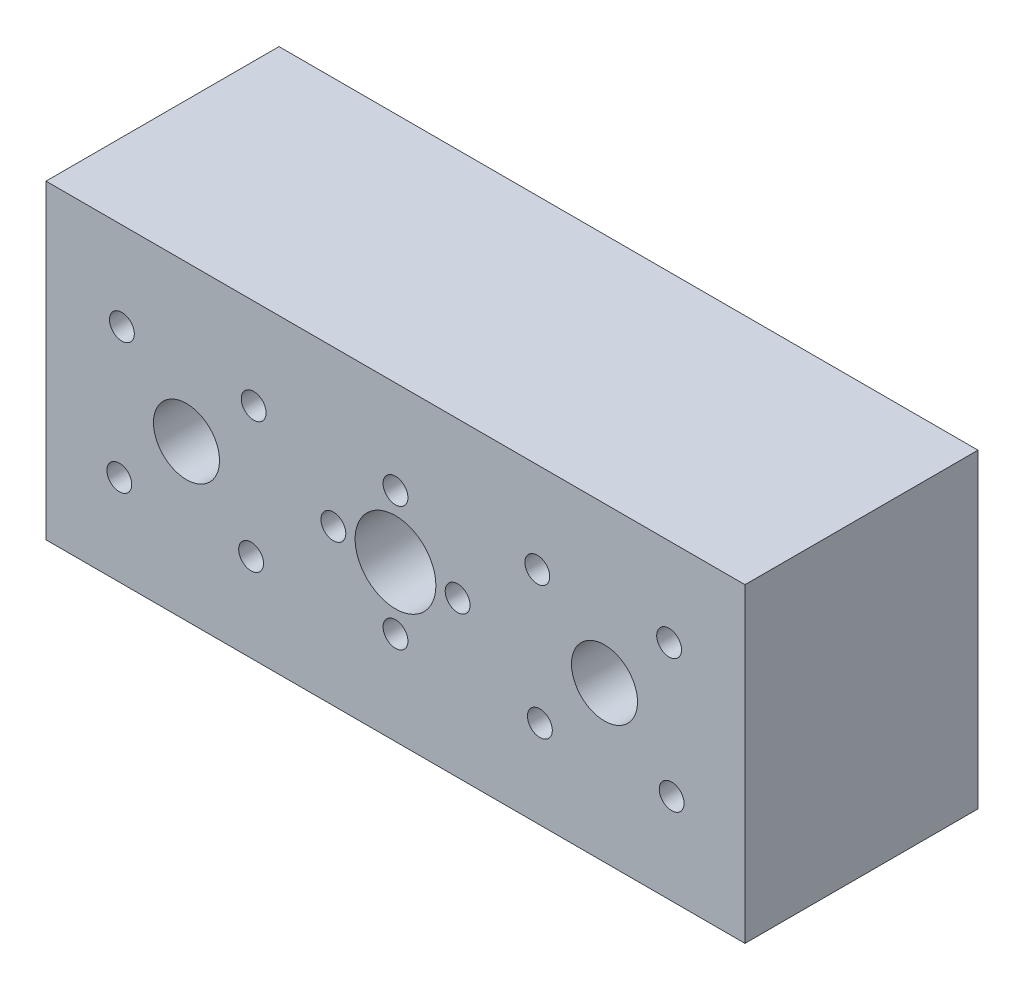
ISO-10303-21;
HEADER;
FILE_DESCRIPTION(('STEP AP214'),'2;1');
FILE_NAME('part.step','',(''),(''),'','','');
FILE_SCHEMA(('AUTOMOTIVE_DESIGN { 1 0 10303 214 1 1 1 1 }'));
ENDSEC;
DATA;
#1=APPLICATION_CONTEXT('core data for automotive mechanical design processes');
#2=APPLICATION_PROTOCOL_DEFINITION('international standard','automotive_design',2000,#1);
#3=PRODUCT_CONTEXT('',#1,'mechanical');
#4=PRODUCT('Part','Part','',(#3));
#5=PRODUCT_RELATED_PRODUCT_CATEGORY('part','',(#4));
#6=PRODUCT_DEFINITION_FORMATION('','',#4);
#7=PRODUCT_DEFINITION_CONTEXT('part definition',#1,'design');
#8=PRODUCT_DEFINITION('design','',#6,#7);
#9=PRODUCT_DEFINITION_SHAPE('','',#8);
#10=(LENGTH_UNIT() NAMED_UNIT(*) SI_UNIT(.MILLI.,.METRE.));
#11=(NAMED_UNIT(*) PLANE_ANGLE_UNIT() SI_UNIT($,.RADIAN.));
#12=(NAMED_UNIT(*) SI_UNIT($,.STERADIAN.) SOLID_ANGLE_UNIT());
#13=UNCERTAINTY_MEASURE_WITH_UNIT(LENGTH_MEASURE(1.E-05),#10,'distance_accuracy_value','');
#14=(GEOMETRIC_REPRESENTATION_CONTEXT(3) GLOBAL_UNCERTAINTY_ASSIGNED_CONTEXT((#13)) GLOBAL_UNIT_ASSIGNED_CONTEXT((#10,
#11,#12)) REPRESENTATION_CONTEXT('',''));
#15=CARTESIAN_POINT('',(0.,0.,0.));
#16=DIRECTION('',(0.,0.,1.));
#17=DIRECTION('',(1.,0.,0.));
#18=AXIS2_PLACEMENT_3D('',#15,#16,#17);
#19=CARTESIAN_POINT('',(45.,-20.,30.));
#20=DIRECTION('',(-1.,0.,0.));
#21=DIRECTION('',(0.,0.,1.));
#22=AXIS2_PLACEMENT_3D('',#19,#20,#21);
#23=PLANE('',#22);
#24=DIRECTION('',(0.,1.,0.));
#25=VECTOR('',#24,1.);
#26=CARTESIAN_POINT('',(45.,-20.,0.));
#27=LINE('',#26,#25);
#28=CARTESIAN_POINT('',(45.,-20.,0.));
#29=VERTEX_POINT('',#28);
#30=CARTESIAN_POINT('',(45.,20.,0.));
#31=VERTEX_POINT('',#30);
#32=EDGE_CURVE('E101',#29,#31,#27,.T.);
#33=ORIENTED_EDGE('',*,*,#32,.T.);
#34=DIRECTION('',(0.,0.,-1.));
#35=VECTOR('',#34,1.);
#36=CARTESIAN_POINT('',(45.,20.,30.));
#37=LINE('',#36,#35);
#38=CARTESIAN_POINT('',(45.,20.,30.));
#39=VERTEX_POINT('',#38);
#40=EDGE_CURVE('E11',#39,#31,#37,.T.);
#41=ORIENTED_EDGE('',*,*,#40,.F.);
#42=DIRECTION('',(0.,1.,0.));
#43=VECTOR('',#42,1.);
#44=CARTESIAN_POINT('',(45.,-20.,30.));
#45=LINE('',#44,#43);
#46=CARTESIAN_POINT('',(45.,-20.,30.));
#47=VERTEX_POINT('',#46);
#48=EDGE_CURVE('E88',#47,#39,#45,.T.);
#49=ORIENTED_EDGE('',*,*,#48,.F.);
#50=DIRECTION('',(0.,0.,-1.));
#51=VECTOR('',#50,1.);
#52=CARTESIAN_POINT('',(45.,-20.,30.));
#53=LINE('',#52,#51);
#54=EDGE_CURVE('E97',#47,#29,#53,.T.);
#55=ORIENTED_EDGE('',*,*,#54,.T.);
#56=EDGE_LOOP('',(#33,#41,#49,#55));
#57=FACE_BOUND('',#56,.T.);
#58=ADVANCED_FACE('F35',(#57),#23,.F.);
#59=CARTESIAN_POINT('',(-45.,20.,30.));
#60=DIRECTION('',(0.,-1.,0.));
#61=DIRECTION('',(0.,0.,-1.));
#62=AXIS2_PLACEMENT_3D('',#59,#60,#61);
#63=PLANE('',#62);
#64=DIRECTION('',(-1.,0.,0.));
#65=VECTOR('',#64,1.);
#66=CARTESIAN_POINT('',(-45.,20.,0.));
#67=LINE('',#66,#65);
#68=CARTESIAN_POINT('',(-45.,20.,0.));
#69=VERTEX_POINT('',#68);
#70=EDGE_CURVE('E92',#31,#69,#67,.T.);
#71=ORIENTED_EDGE('',*,*,#70,.T.);
#72=DIRECTION('',(0.,0.,-1.));
#73=VECTOR('',#72,1.);
#74=CARTESIAN_POINT('',(-45.,20.,30.));
#75=LINE('',#74,#73);
#76=CARTESIAN_POINT('',(-45.,20.,30.));
#77=VERTEX_POINT('',#76);
#78=EDGE_CURVE('E44',#77,#69,#75,.T.);
#79=ORIENTED_EDGE('',*,*,#78,.F.);
#80=DIRECTION('',(-1.,0.,0.));
#81=VECTOR('',#80,1.);
#82=CARTESIAN_POINT('',(-45.,20.,30.));
#83=LINE('',#82,#81);
#84=EDGE_CURVE('E83',#39,#77,#83,.T.);
#85=ORIENTED_EDGE('',*,*,#84,.F.);
#86=ORIENTED_EDGE('',*,*,#40,.T.);
#87=EDGE_LOOP('',(#71,#79,#85,#86));
#88=FACE_BOUND('',#87,.T.);
#89=ADVANCED_FACE('F91',(#88),#63,.F.);
#90=CARTESIAN_POINT('',(-45.,-20.,30.));
#91=DIRECTION('',(1.,0.,0.));
#92=DIRECTION('',(0.,0.,-1.));
#93=AXIS2_PLACEMENT_3D('',#90,#91,#92);
#94=PLANE('',#93);
#95=DIRECTION('',(0.,-1.,0.));
#96=VECTOR('',#95,1.);
#97=CARTESIAN_POINT('',(-45.,-20.,0.));
#98=LINE('',#97,#96);
#99=CARTESIAN_POINT('',(-45.,-20.,0.));
#100=VERTEX_POINT('',#99);
#101=EDGE_CURVE('E70',#69,#100,#98,.T.);
#102=ORIENTED_EDGE('',*,*,#101,.T.);
#103=DIRECTION('',(0.,0.,-1.));
#104=VECTOR('',#103,1.);
#105=CARTESIAN_POINT('',(-45.,-20.,30.));
#106=LINE('',#105,#104);
#107=CARTESIAN_POINT('',(-45.,-20.,30.));
#108=VERTEX_POINT('',#107);
#109=EDGE_CURVE('E93',#108,#100,#106,.T.);
#110=ORIENTED_EDGE('',*,*,#109,.F.);
#111=DIRECTION('',(0.,-1.,0.));
#112=VECTOR('',#111,1.);
#113=CARTESIAN_POINT('',(-45.,-20.,30.));
#114=LINE('',#113,#112);
#115=EDGE_CURVE('E86',#77,#108,#114,.T.);
#116=ORIENTED_EDGE('',*,*,#115,.F.);
#117=ORIENTED_EDGE('',*,*,#78,.T.);
#118=EDGE_LOOP('',(#102,#110,#116,#117));
#119=FACE_BOUND('',#118,.T.);
#120=ADVANCED_FACE('F95',(#119),#94,.F.);
#121=CARTESIAN_POINT('',(-45.,-20.,30.));
#122=DIRECTION('',(0.,1.,0.));
#123=DIRECTION('',(0.,0.,1.));
#124=AXIS2_PLACEMENT_3D('',#121,#122,#123);
#125=PLANE('',#124);
#126=DIRECTION('',(1.,0.,0.));
#127=VECTOR('',#126,1.);
#128=CARTESIAN_POINT('',(-45.,-20.,0.));
#129=LINE('',#128,#127);
#130=EDGE_CURVE('E76',#100,#29,#129,.T.);
#131=ORIENTED_EDGE('',*,*,#130,.T.);
#132=ORIENTED_EDGE('',*,*,#54,.F.);
#133=DIRECTION('',(1.,0.,0.));
#134=VECTOR('',#133,1.);
#135=CARTESIAN_POINT('',(-45.,-20.,30.));
#136=LINE('',#135,#134);
#137=EDGE_CURVE('E53',#108,#47,#136,.T.);
#138=ORIENTED_EDGE('',*,*,#137,.F.);
#139=ORIENTED_EDGE('',*,*,#109,.T.);
#140=EDGE_LOOP('',(#131,#132,#138,#139));
#141=FACE_BOUND('',#140,.T.);
#142=ADVANCED_FACE('F212',(#141),#125,.F.);
#143=CARTESIAN_POINT('',(0.,0.,30.));
#144=DIRECTION('',(0.,0.,-1.));
#145=DIRECTION('',(-1.,0.,0.));
#146=AXIS2_PLACEMENT_3D('',#143,#144,#145);
#147=PLANE('',#146);
#148=CARTESIAN_POINT('',(-18.2611815212582,8.31934769647122,30.));
#149=DIRECTION('',(0.,0.,-1.));
#150=DIRECTION('',(-1.,0.,0.));
#151=AXIS2_PLACEMENT_3D('',#148,#149,#150);
#152=CIRCLE('',#151,1.60000000000001);
#153=CARTESIAN_POINT('',(-19.8611815212582,8.31934769647122,30.));
#154=VERTEX_POINT('',#153);
#155=EDGE_CURVE('E460',#154,#154,#152,.T.);
#156=ORIENTED_EDGE('',*,*,#155,.T.);
#157=EDGE_LOOP('',(#156));
#158=FACE_BOUND('',#157,.T.);
#159=CARTESIAN_POINT('',(-35.228561011451,8.64803179372157,30.));
#160=DIRECTION('',(0.,0.,-1.));
#161=DIRECTION('',(-1.,0.,0.));
#162=AXIS2_PLACEMENT_3D('',#159,#160,#161);
#163=CIRCLE('',#162,1.60000000000001);
#164=CARTESIAN_POINT('',(-36.828561011451,8.64803179372157,30.));
#165=VERTEX_POINT('',#164);
#166=EDGE_CURVE('E466',#165,#165,#163,.T.);
#167=ORIENTED_EDGE('',*,*,#166,.T.);
#168=EDGE_LOOP('',(#167));
#169=FACE_BOUND('',#168,.T.);
#170=CARTESIAN_POINT('',(-35.5572451087013,-8.31934769647122,30.));
#171=DIRECTION('',(0.,0.,-1.));
#172=DIRECTION('',(-1.,0.,0.));
#173=AXIS2_PLACEMENT_3D('',#170,#171,#172);
#174=CIRCLE('',#173,1.60000000000001);
#175=CARTESIAN_POINT('',(-37.1572451087013,-8.31934769647122,30.));
#176=VERTEX_POINT('',#175);
#177=EDGE_CURVE('E472',#176,#176,#174,.T.);
#178=ORIENTED_EDGE('',*,*,#177,.T.);
#179=EDGE_LOOP('',(#178));
#180=FACE_BOUND('',#179,.T.);
#181=CARTESIAN_POINT('',(-18.5898656185085,-8.64803179372157,30.));
#182=DIRECTION('',(0.,0.,-1.));
#183=DIRECTION('',(-1.,0.,0.));
#184=AXIS2_PLACEMENT_3D('',#181,#182,#183);
#185=CIRCLE('',#184,1.60000000000001);
#186=CARTESIAN_POINT('',(-20.1898656185086,-8.64803179372157,30.));
#187=VERTEX_POINT('',#186);
#188=EDGE_CURVE('E478',#187,#187,#185,.T.);
#189=ORIENTED_EDGE('',*,*,#188,.T.);
#190=EDGE_LOOP('',(#189));
#191=FACE_BOUND('',#190,.T.);
#192=CARTESIAN_POINT('',(-26.9092133149798,0.,30.));
#193=DIRECTION('',(0.,0.,-1.));
#194=DIRECTION('',(-1.,0.,0.));
#195=AXIS2_PLACEMENT_3D('',#192,#193,#194);
#196=CIRCLE('',#195,4.25000000000001);
#197=CARTESIAN_POINT('',(-31.1592133149798,0.,30.));
#198=VERTEX_POINT('',#197);
#199=EDGE_CURVE('E128',#198,#198,#196,.T.);
#200=ORIENTED_EDGE('',*,*,#199,.T.);
#201=EDGE_LOOP('',(#200));
#202=FACE_BOUND('',#201,.T.);
#203=CARTESIAN_POINT('',(18.2611815212582,8.31934769647122,30.));
#204=DIRECTION('',(0.,0.,-1.));
#205=DIRECTION('',(-1.,0.,0.));
#206=AXIS2_PLACEMENT_3D('',#203,#204,#205);
#207=CIRCLE('',#206,1.60000000000001);
#208=CARTESIAN_POINT('',(16.6611815212582,8.31934769647122,30.));
#209=VERTEX_POINT('',#208);
#210=EDGE_CURVE('E120',#209,#209,#207,.T.);
#211=ORIENTED_EDGE('',*,*,#210,.T.);
#212=EDGE_LOOP('',(#211));
#213=FACE_BOUND('',#212,.T.);
#214=CARTESIAN_POINT('',(35.228561011451,8.64803179372157,30.));
#215=DIRECTION('',(0.,0.,-1.));
#216=DIRECTION('',(-1.,0.,0.));
#217=AXIS2_PLACEMENT_3D('',#214,#215,#216);
#218=CIRCLE('',#217,1.60000000000001);
#219=CARTESIAN_POINT('',(33.628561011451,8.64803179372157,30.));
#220=VERTEX_POINT('',#219);
#221=EDGE_CURVE('E137',#220,#220,#218,.T.);
#222=ORIENTED_EDGE('',*,*,#221,.T.);
#223=EDGE_LOOP('',(#222));
#224=FACE_BOUND('',#223,.T.);
#225=CARTESIAN_POINT('',(35.5572451087013,-8.31934769647122,30.));
#226=DIRECTION('',(0.,0.,-1.));
#227=DIRECTION('',(-1.,0.,0.));
#228=AXIS2_PLACEMENT_3D('',#225,#226,#227);
#229=CIRCLE('',#228,1.60000000000001);
#230=CARTESIAN_POINT('',(33.9572451087013,-8.31934769647122,30.));
#231=VERTEX_POINT('',#230);
#232=EDGE_CURVE('E143',#231,#231,#229,.T.);
#233=ORIENTED_EDGE('',*,*,#232,.T.);
#234=EDGE_LOOP('',(#233));
#235=FACE_BOUND('',#234,.T.);
#236=CARTESIAN_POINT('',(18.5898656185085,-8.64803179372157,30.));
#237=DIRECTION('',(0.,0.,-1.));
#238=DIRECTION('',(-1.,0.,0.));
#239=AXIS2_PLACEMENT_3D('',#236,#237,#238);
#240=CIRCLE('',#239,1.60000000000001);
#241=CARTESIAN_POINT('',(16.9898656185085,-8.64803179372157,30.));
#242=VERTEX_POINT('',#241);
#243=EDGE_CURVE('E149',#242,#242,#240,.T.);
#244=ORIENTED_EDGE('',*,*,#243,.T.);
#245=EDGE_LOOP('',(#244));
#246=FACE_BOUND('',#245,.T.);
#247=CARTESIAN_POINT('',(26.9092133149798,0.,30.));
#248=DIRECTION('',(0.,0.,-1.));
#249=DIRECTION('',(-1.,0.,0.));
#250=AXIS2_PLACEMENT_3D('',#247,#248,#249);
#251=CIRCLE('',#250,4.25000000000001);
#252=CARTESIAN_POINT('',(22.6592133149797,0.,30.));
#253=VERTEX_POINT('',#252);
#254=EDGE_CURVE('E152',#253,#253,#251,.T.);
#255=ORIENTED_EDGE('',*,*,#254,.T.);
#256=EDGE_LOOP('',(#255));
#257=FACE_BOUND('',#256,.T.);
#258=CARTESIAN_POINT('',(8.,0.,30.));
#259=DIRECTION('',(0.,0.,1.));
#260=DIRECTION('',(1.,0.,0.));
#261=AXIS2_PLACEMENT_3D('',#258,#259,#260);
#262=CIRCLE('',#261,1.60000000000001);
#263=CARTESIAN_POINT('',(9.60000000000001,0.,30.));
#264=VERTEX_POINT('',#263);
#265=EDGE_CURVE('E155',#264,#264,#262,.T.);
#266=ORIENTED_EDGE('',*,*,#265,.F.);
#267=EDGE_LOOP('',(#266));
#268=FACE_BOUND('',#267,.T.);
#269=CARTESIAN_POINT('',(0.,8.,30.));
#270=DIRECTION('',(0.,0.,1.));
#271=DIRECTION('',(1.,0.,0.));
#272=AXIS2_PLACEMENT_3D('',#269,#270,#271);
#273=CIRCLE('',#272,1.60000000000001);
#274=CARTESIAN_POINT('',(1.6000000000001,8.,30.));
#275=VERTEX_POINT('',#274);
#276=EDGE_CURVE('E161',#275,#275,#273,.T.);
#277=ORIENTED_EDGE('',*,*,#276,.F.);
#278=EDGE_LOOP('',(#277));
#279=FACE_BOUND('',#278,.T.);
#280=CARTESIAN_POINT('',(-8.,0.,30.));
#281=DIRECTION('',(0.,0.,1.));
#282=DIRECTION('',(1.,0.,0.));
#283=AXIS2_PLACEMENT_3D('',#280,#281,#282);
#284=CIRCLE('',#283,1.60000000000001);
#285=CARTESIAN_POINT('',(-6.39999999999999,0.,30.));
#286=VERTEX_POINT('',#285);
#287=EDGE_CURVE('E167',#286,#286,#284,.T.);
#288=ORIENTED_EDGE('',*,*,#287,.F.);
#289=EDGE_LOOP('',(#288));
#290=FACE_BOUND('',#289,.T.);
#291=CARTESIAN_POINT('',(0.,-8.,30.));
#292=DIRECTION('',(0.,0.,1.));
#293=DIRECTION('',(1.,0.,0.));
#294=AXIS2_PLACEMENT_3D('',#291,#292,#293);
#295=CIRCLE('',#294,1.60000000000001);
#296=CARTESIAN_POINT('',(1.59999999999998,-8.,30.));
#297=VERTEX_POINT('',#296);
#298=EDGE_CURVE('E173',#297,#297,#295,.T.);
#299=ORIENTED_EDGE('',*,*,#298,.F.);
#300=EDGE_LOOP('',(#299));
#301=FACE_BOUND('',#300,.T.);
#302=CARTESIAN_POINT('',(0.,0.,30.));
#303=DIRECTION('',(0.,0.,1.));
#304=DIRECTION('',(1.,0.,0.));
#305=AXIS2_PLACEMENT_3D('',#302,#303,#304);
#306=CIRCLE('',#305,5.20000000000001);
#307=CARTESIAN_POINT('',(5.20000000000001,0.,30.));
#308=VERTEX_POINT('',#307);
#309=EDGE_CURVE('E179',#308,#308,#306,.T.);
#310=ORIENTED_EDGE('',*,*,#309,.F.);
#311=EDGE_LOOP('',(#310));
#312=FACE_BOUND('',#311,.T.);
#313=ORIENTED_EDGE('',*,*,#48,.T.);
#314=ORIENTED_EDGE('',*,*,#84,.T.);
#315=ORIENTED_EDGE('',*,*,#115,.T.);
#316=ORIENTED_EDGE('',*,*,#137,.T.);
#317=EDGE_LOOP('',(#313,#314,#315,#316));
#318=FACE_BOUND('',#317,.T.);
#319=ADVANCED_FACE('F84',(#158,#169,#180,#191,#202,#213,#224,#235,#246,#257,#268,#279,#290,#301,
#312,#318),#147,.F.);
#320=CARTESIAN_POINT('',(0.,0.,0.));
#321=DIRECTION('',(0.,0.,-1.));
#322=DIRECTION('',(-1.,0.,0.));
#323=AXIS2_PLACEMENT_3D('',#320,#321,#322);
#324=PLANE('',#323);
#325=CARTESIAN_POINT('',(-26.9092133149798,0.,0.));
#326=DIRECTION('',(0.,0.,-1.));
#327=DIRECTION('',(-1.,0.,0.));
#328=AXIS2_PLACEMENT_3D('',#325,#326,#327);
#329=CIRCLE('',#328,8.50000000000001);
#330=CARTESIAN_POINT('',(-35.4092133149798,0.,0.));
#331=VERTEX_POINT('',#330);
#332=EDGE_CURVE('E453',#331,#331,#329,.T.);
#333=ORIENTED_EDGE('',*,*,#332,.F.);
#334=EDGE_LOOP('',(#333));
#335=FACE_BOUND('',#334,.T.);
#336=CARTESIAN_POINT('',(-18.2611815212582,8.31934769647122,0.));
#337=DIRECTION('',(0.,0.,-1.));
#338=DIRECTION('',(-1.,0.,0.));
#339=AXIS2_PLACEMENT_3D('',#336,#337,#338);
#340=CIRCLE('',#339,1.60000000000001);
#341=CARTESIAN_POINT('',(-19.8611815212582,8.31934769647122,0.));
#342=VERTEX_POINT('',#341);
#343=EDGE_CURVE('E457',#342,#342,#340,.T.);
#344=ORIENTED_EDGE('',*,*,#343,.F.);
#345=EDGE_LOOP('',(#344));
#346=FACE_BOUND('',#345,.T.);
#347=CARTESIAN_POINT('',(-35.228561011451,8.64803179372157,0.));
#348=DIRECTION('',(0.,0.,-1.));
#349=DIRECTION('',(-1.,0.,0.));
#350=AXIS2_PLACEMENT_3D('',#347,#348,#349);
#351=CIRCLE('',#350,1.60000000000002);
#352=CARTESIAN_POINT('',(-36.828561011451,8.64803179372157,0.));
#353=VERTEX_POINT('',#352);
#354=EDGE_CURVE('E463',#353,#353,#351,.T.);
#355=ORIENTED_EDGE('',*,*,#354,.F.);
#356=EDGE_LOOP('',(#355));
#357=FACE_BOUND('',#356,.T.);
#358=CARTESIAN_POINT('',(-35.5572451087013,-8.31934769647122,0.));
#359=DIRECTION('',(0.,0.,-1.));
#360=DIRECTION('',(-1.,0.,0.));
#361=AXIS2_PLACEMENT_3D('',#358,#359,#360);
#362=CIRCLE('',#361,1.60000000000002);
#363=CARTESIAN_POINT('',(-37.1572451087013,-8.31934769647122,0.));
#364=VERTEX_POINT('',#363);
#365=EDGE_CURVE('E469',#364,#364,#362,.T.);
#366=ORIENTED_EDGE('',*,*,#365,.F.);
#367=EDGE_LOOP('',(#366));
#368=FACE_BOUND('',#367,.T.);
#369=CARTESIAN_POINT('',(-18.5898656185085,-8.64803179372157,0.));
#370=DIRECTION('',(0.,0.,-1.));
#371=DIRECTION('',(-1.,0.,0.));
#372=AXIS2_PLACEMENT_3D('',#369,#370,#371);
#373=CIRCLE('',#372,1.60000000000001);
#374=CARTESIAN_POINT('',(-20.1898656185086,-8.64803179372157,0.));
#375=VERTEX_POINT('',#374);
#376=EDGE_CURVE('E475',#375,#375,#373,.T.);
#377=ORIENTED_EDGE('',*,*,#376,.F.);
#378=EDGE_LOOP('',(#377));
#379=FACE_BOUND('',#378,.T.);
#380=CARTESIAN_POINT('',(26.9092133149798,0.,0.));
#381=DIRECTION('',(0.,0.,-1.));
#382=DIRECTION('',(-1.,0.,0.));
#383=AXIS2_PLACEMENT_3D('',#380,#381,#382);
#384=CIRCLE('',#383,8.50000000000001);
#385=CARTESIAN_POINT('',(18.4092133149797,0.,0.));
#386=VERTEX_POINT('',#385);
#387=EDGE_CURVE('E123',#386,#386,#384,.T.);
#388=ORIENTED_EDGE('',*,*,#387,.F.);
#389=EDGE_LOOP('',(#388));
#390=FACE_BOUND('',#389,.T.);
#391=CARTESIAN_POINT('',(18.2611815212582,8.31934769647122,0.));
#392=DIRECTION('',(0.,0.,-1.));
#393=DIRECTION('',(-1.,0.,0.));
#394=AXIS2_PLACEMENT_3D('',#391,#392,#393);
#395=CIRCLE('',#394,1.60000000000001);
#396=CARTESIAN_POINT('',(16.6611815212582,8.31934769647122,0.));
#397=VERTEX_POINT('',#396);
#398=EDGE_CURVE('E115',#397,#397,#395,.T.);
#399=ORIENTED_EDGE('',*,*,#398,.F.);
#400=EDGE_LOOP('',(#399));
#401=FACE_BOUND('',#400,.T.);
#402=CARTESIAN_POINT('',(35.228561011451,8.64803179372157,0.));
#403=DIRECTION('',(0.,0.,-1.));
#404=DIRECTION('',(-1.,0.,0.));
#405=AXIS2_PLACEMENT_3D('',#402,#403,#404);
#406=CIRCLE('',#405,1.60000000000002);
#407=CARTESIAN_POINT('',(33.628561011451,8.64803179372157,0.));
#408=VERTEX_POINT('',#407);
#409=EDGE_CURVE('E134',#408,#408,#406,.T.);
#410=ORIENTED_EDGE('',*,*,#409,.F.);
#411=EDGE_LOOP('',(#410));
#412=FACE_BOUND('',#411,.T.);
#413=CARTESIAN_POINT('',(35.5572451087013,-8.31934769647122,0.));
#414=DIRECTION('',(0.,0.,-1.));
#415=DIRECTION('',(-1.,0.,0.));
#416=AXIS2_PLACEMENT_3D('',#413,#414,#415);
#417=CIRCLE('',#416,1.60000000000002);
#418=CARTESIAN_POINT('',(33.9572451087013,-8.31934769647122,0.));
#419=VERTEX_POINT('',#418);
#420=EDGE_CURVE('E140',#419,#419,#417,.T.);
#421=ORIENTED_EDGE('',*,*,#420,.F.);
#422=EDGE_LOOP('',(#421));
#423=FACE_BOUND('',#422,.T.);
#424=CARTESIAN_POINT('',(18.5898656185085,-8.64803179372157,0.));
#425=DIRECTION('',(0.,0.,-1.));
#426=DIRECTION('',(-1.,0.,0.));
#427=AXIS2_PLACEMENT_3D('',#424,#425,#426);
#428=CIRCLE('',#427,1.60000000000001);
#429=CARTESIAN_POINT('',(16.9898656185085,-8.64803179372157,0.));
#430=VERTEX_POINT('',#429);
#431=EDGE_CURVE('E146',#430,#430,#428,.T.);
#432=ORIENTED_EDGE('',*,*,#431,.F.);
#433=EDGE_LOOP('',(#432));
#434=FACE_BOUND('',#433,.T.);
#435=CARTESIAN_POINT('',(8.,0.,0.));
#436=DIRECTION('',(0.,0.,1.));
#437=DIRECTION('',(1.,0.,0.));
#438=AXIS2_PLACEMENT_3D('',#435,#436,#437);
#439=CIRCLE('',#438,1.60000000000001);
#440=CARTESIAN_POINT('',(9.60000000000001,0.,0.));
#441=VERTEX_POINT('',#440);
#442=EDGE_CURVE('E158',#441,#441,#439,.T.);
#443=ORIENTED_EDGE('',*,*,#442,.T.);
#444=EDGE_LOOP('',(#443));
#445=FACE_BOUND('',#444,.T.);
#446=CARTESIAN_POINT('',(0.,8.,0.));
#447=DIRECTION('',(0.,0.,1.));
#448=DIRECTION('',(1.,0.,0.));
#449=AXIS2_PLACEMENT_3D('',#446,#447,#448);
#450=CIRCLE('',#449,1.60000000000001);
#451=CARTESIAN_POINT('',(1.60000000000009,8.,0.));
#452=VERTEX_POINT('',#451);
#453=EDGE_CURVE('E164',#452,#452,#450,.T.);
#454=ORIENTED_EDGE('',*,*,#453,.T.);
#455=EDGE_LOOP('',(#454));
#456=FACE_BOUND('',#455,.T.);
#457=CARTESIAN_POINT('',(-8.,0.,0.));
#458=DIRECTION('',(0.,0.,1.));
#459=DIRECTION('',(1.,0.,0.));
#460=AXIS2_PLACEMENT_3D('',#457,#458,#459);
#461=CIRCLE('',#460,1.60000000000001);
#462=CARTESIAN_POINT('',(-6.39999999999999,0.,0.));
#463=VERTEX_POINT('',#462);
#464=EDGE_CURVE('E170',#463,#463,#461,.T.);
#465=ORIENTED_EDGE('',*,*,#464,.T.);
#466=EDGE_LOOP('',(#465));
#467=FACE_BOUND('',#466,.T.);
#468=CARTESIAN_POINT('',(0.,-8.,0.));
#469=DIRECTION('',(0.,0.,1.));
#470=DIRECTION('',(1.,0.,0.));
#471=AXIS2_PLACEMENT_3D('',#468,#469,#470);
#472=CIRCLE('',#471,1.60000000000001);
#473=CARTESIAN_POINT('',(1.59999999999998,-8.,0.));
#474=VERTEX_POINT('',#473);
#475=EDGE_CURVE('E176',#474,#474,#472,.T.);
#476=ORIENTED_EDGE('',*,*,#475,.T.);
#477=EDGE_LOOP('',(#476));
#478=FACE_BOUND('',#477,.T.);
#479=CARTESIAN_POINT('',(0.,0.,0.));
#480=DIRECTION('',(0.,0.,1.));
#481=DIRECTION('',(1.,0.,0.));
#482=AXIS2_PLACEMENT_3D('',#479,#480,#481);
#483=CIRCLE('',#482,4.25000000000001);
#484=CARTESIAN_POINT('',(4.25000000000001,0.,0.));
#485=VERTEX_POINT('',#484);
#486=EDGE_CURVE('E104',#485,#485,#483,.T.);
#487=ORIENTED_EDGE('',*,*,#486,.T.);
#488=EDGE_LOOP('',(#487));
#489=FACE_BOUND('',#488,.T.);
#490=ORIENTED_EDGE('',*,*,#32,.F.);
#491=ORIENTED_EDGE('',*,*,#130,.F.);
#492=ORIENTED_EDGE('',*,*,#101,.F.);
#493=ORIENTED_EDGE('',*,*,#70,.F.);
#494=EDGE_LOOP('',(#490,#491,#492,#493));
#495=FACE_BOUND('',#494,.T.);
#496=ADVANCED_FACE('F187',(#335,#346,#357,#368,#379,#390,#401,#412,#423,#434,#445,#456,#467,
#478,#489,#495),#324,.T.);
#497=CARTESIAN_POINT('',(0.,0.,30.));
#498=DIRECTION('',(0.,0.,1.));
#499=DIRECTION('',(1.,0.,0.));
#500=AXIS2_PLACEMENT_3D('',#497,#498,#499);
#501=CYLINDRICAL_SURFACE('',#500,4.25000000000001);
#502=CARTESIAN_POINT('',(0.,0.,18.));
#503=DIRECTION('',(0.,0.,-1.));
#504=DIRECTION('',(-1.,0.,0.));
#505=AXIS2_PLACEMENT_3D('',#502,#503,#504);
#506=CIRCLE('',#505,4.25000000000001);
#507=CARTESIAN_POINT('',(-4.25000000000001,0.,18.));
#508=VERTEX_POINT('',#507);
#509=EDGE_CURVE('E110',#508,#508,#506,.F.);
#510=ORIENTED_EDGE('',*,*,#509,.T.);
#511=EDGE_LOOP('',(#510));
#512=FACE_BOUND('',#511,.T.);
#513=ORIENTED_EDGE('',*,*,#486,.F.);
#514=EDGE_LOOP('',(#513));
#515=FACE_BOUND('',#514,.T.);
#516=ADVANCED_FACE('F190',(#512,#515),#501,.F.);
#517=CARTESIAN_POINT('',(0.,0.,18.));
#518=DIRECTION('',(0.,0.,-1.));
#519=DIRECTION('',(-1.,0.,0.));
#520=AXIS2_PLACEMENT_3D('',#517,#518,#519);
#521=PLANE('',#520);
#522=CARTESIAN_POINT('',(0.,0.,18.));
#523=DIRECTION('',(0.,0.,1.));
#524=DIRECTION('',(1.,0.,0.));
#525=AXIS2_PLACEMENT_3D('',#522,#523,#524);
#526=CIRCLE('',#525,5.20000000000001);
#527=CARTESIAN_POINT('',(5.20000000000001,0.,18.));
#528=VERTEX_POINT('',#527);
#529=EDGE_CURVE('E112',#528,#528,#526,.T.);
#530=ORIENTED_EDGE('',*,*,#529,.T.);
#531=EDGE_LOOP('',(#530));
#532=FACE_BOUND('',#531,.T.);
#533=ORIENTED_EDGE('',*,*,#509,.F.);
#534=EDGE_LOOP('',(#533));
#535=FACE_BOUND('',#534,.T.);
#536=ADVANCED_FACE('F192',(#532,#535),#521,.F.);
#537=CARTESIAN_POINT('',(0.,0.,30.));
#538=DIRECTION('',(0.,0.,1.));
#539=DIRECTION('',(1.,0.,0.));
#540=AXIS2_PLACEMENT_3D('',#537,#538,#539);
#541=CYLINDRICAL_SURFACE('',#540,5.20000000000001);
#542=ORIENTED_EDGE('',*,*,#529,.F.);
#543=EDGE_LOOP('',(#542));
#544=FACE_BOUND('',#543,.T.);
#545=ORIENTED_EDGE('',*,*,#309,.T.);
#546=EDGE_LOOP('',(#545));
#547=FACE_BOUND('',#546,.T.);
#548=ADVANCED_FACE('F199',(#544,#547),#541,.F.);
#549=CARTESIAN_POINT('',(0.,-8.,30.));
#550=DIRECTION('',(0.,0.,1.));
#551=DIRECTION('',(1.,0.,0.));
#552=AXIS2_PLACEMENT_3D('',#549,#550,#551);
#553=CYLINDRICAL_SURFACE('',#552,1.60000000000001);
#554=ORIENTED_EDGE('',*,*,#475,.F.);
#555=EDGE_LOOP('',(#554));
#556=FACE_BOUND('',#555,.T.);
#557=ORIENTED_EDGE('',*,*,#298,.T.);
#558=EDGE_LOOP('',(#557));
#559=FACE_BOUND('',#558,.T.);
#560=ADVANCED_FACE('F265',(#556,#559),#553,.F.);
#561=CARTESIAN_POINT('',(-8.,0.,30.));
#562=DIRECTION('',(0.,0.,1.));
#563=DIRECTION('',(1.,0.,0.));
#564=AXIS2_PLACEMENT_3D('',#561,#562,#563);
#565=CYLINDRICAL_SURFACE('',#564,1.60000000000001);
#566=ORIENTED_EDGE('',*,*,#464,.F.);
#567=EDGE_LOOP('',(#566));
#568=FACE_BOUND('',#567,.T.);
#569=ORIENTED_EDGE('',*,*,#287,.T.);
#570=EDGE_LOOP('',(#569));
#571=FACE_BOUND('',#570,.T.);
#572=ADVANCED_FACE('F274',(#568,#571),#565,.F.);
#573=CARTESIAN_POINT('',(0.,8.,30.));
#574=DIRECTION('',(0.,0.,1.));
#575=DIRECTION('',(1.,0.,0.));
#576=AXIS2_PLACEMENT_3D('',#573,#574,#575);
#577=CYLINDRICAL_SURFACE('',#576,1.60000000000001);
#578=ORIENTED_EDGE('',*,*,#453,.F.);
#579=EDGE_LOOP('',(#578));
#580=FACE_BOUND('',#579,.T.);
#581=ORIENTED_EDGE('',*,*,#276,.T.);
#582=EDGE_LOOP('',(#581));
#583=FACE_BOUND('',#582,.T.);
#584=ADVANCED_FACE('F283',(#580,#583),#577,.F.);
#585=CARTESIAN_POINT('',(8.,0.,30.));
#586=DIRECTION('',(0.,0.,1.));
#587=DIRECTION('',(1.,0.,0.));
#588=AXIS2_PLACEMENT_3D('',#585,#586,#587);
#589=CYLINDRICAL_SURFACE('',#588,1.60000000000001);
#590=ORIENTED_EDGE('',*,*,#442,.F.);
#591=EDGE_LOOP('',(#590));
#592=FACE_BOUND('',#591,.T.);
#593=ORIENTED_EDGE('',*,*,#265,.T.);
#594=EDGE_LOOP('',(#593));
#595=FACE_BOUND('',#594,.T.);
#596=ADVANCED_FACE('F292',(#592,#595),#589,.F.);
#597=CARTESIAN_POINT('',(26.9092133149798,0.,0.));
#598=DIRECTION('',(0.,0.,-1.));
#599=DIRECTION('',(-1.,0.,0.));
#600=AXIS2_PLACEMENT_3D('',#597,#598,#599);
#601=CYLINDRICAL_SURFACE('',#600,4.25000000000001);
#602=CARTESIAN_POINT('',(26.9092133149798,0.,20.));
#603=DIRECTION('',(0.,0.,1.));
#604=DIRECTION('',(1.,0.,0.));
#605=AXIS2_PLACEMENT_3D('',#602,#603,#604);
#606=CIRCLE('',#605,4.25000000000001);
#607=CARTESIAN_POINT('',(31.1592133149798,0.,20.));
#608=VERTEX_POINT('',#607);
#609=EDGE_CURVE('E113',#608,#608,#606,.F.);
#610=ORIENTED_EDGE('',*,*,#609,.T.);
#611=EDGE_LOOP('',(#610));
#612=FACE_BOUND('',#611,.T.);
#613=ORIENTED_EDGE('',*,*,#254,.F.);
#614=EDGE_LOOP('',(#613));
#615=FACE_BOUND('',#614,.T.);
#616=ADVANCED_FACE('F301',(#612,#615),#601,.F.);
#617=CARTESIAN_POINT('',(18.5898656185085,-8.64803179372157,0.));
#618=DIRECTION('',(0.,0.,-1.));
#619=DIRECTION('',(-1.,0.,0.));
#620=AXIS2_PLACEMENT_3D('',#617,#618,#619);
#621=CYLINDRICAL_SURFACE('',#620,1.60000000000001);
#622=ORIENTED_EDGE('',*,*,#243,.F.);
#623=EDGE_LOOP('',(#622));
#624=FACE_BOUND('',#623,.T.);
#625=ORIENTED_EDGE('',*,*,#431,.T.);
#626=EDGE_LOOP('',(#625));
#627=FACE_BOUND('',#626,.T.);
#628=ADVANCED_FACE('F311',(#624,#627),#621,.F.);
#629=CARTESIAN_POINT('',(35.5572451087013,-8.31934769647122,0.));
#630=DIRECTION('',(0.,0.,-1.));
#631=DIRECTION('',(-1.,0.,0.));
#632=AXIS2_PLACEMENT_3D('',#629,#630,#631);
#633=CYLINDRICAL_SURFACE('',#632,1.60000000000001);
#634=ORIENTED_EDGE('',*,*,#232,.F.);
#635=EDGE_LOOP('',(#634));
#636=FACE_BOUND('',#635,.T.);
#637=ORIENTED_EDGE('',*,*,#420,.T.);
#638=EDGE_LOOP('',(#637));
#639=FACE_BOUND('',#638,.T.);
#640=ADVANCED_FACE('F320',(#636,#639),#633,.F.);
#641=CARTESIAN_POINT('',(35.228561011451,8.64803179372157,0.));
#642=DIRECTION('',(0.,0.,-1.));
#643=DIRECTION('',(-1.,0.,0.));
#644=AXIS2_PLACEMENT_3D('',#641,#642,#643);
#645=CYLINDRICAL_SURFACE('',#644,1.60000000000001);
#646=ORIENTED_EDGE('',*,*,#221,.F.);
#647=EDGE_LOOP('',(#646));
#648=FACE_BOUND('',#647,.T.);
#649=ORIENTED_EDGE('',*,*,#409,.T.);
#650=EDGE_LOOP('',(#649));
#651=FACE_BOUND('',#650,.T.);
#652=ADVANCED_FACE('F329',(#648,#651),#645,.F.);
#653=CARTESIAN_POINT('',(18.2611815212582,8.31934769647122,0.));
#654=DIRECTION('',(0.,0.,-1.));
#655=DIRECTION('',(-1.,0.,0.));
#656=AXIS2_PLACEMENT_3D('',#653,#654,#655);
#657=CYLINDRICAL_SURFACE('',#656,1.60000000000001);
#658=ORIENTED_EDGE('',*,*,#210,.F.);
#659=EDGE_LOOP('',(#658));
#660=FACE_BOUND('',#659,.T.);
#661=ORIENTED_EDGE('',*,*,#398,.T.);
#662=EDGE_LOOP('',(#661));
#663=FACE_BOUND('',#662,.T.);
#664=ADVANCED_FACE('F338',(#660,#663),#657,.F.);
#665=CARTESIAN_POINT('',(26.9092133149798,0.,20.));
#666=DIRECTION('',(0.,0.,1.));
#667=DIRECTION('',(1.,0.,0.));
#668=AXIS2_PLACEMENT_3D('',#665,#666,#667);
#669=PLANE('',#668);
#670=CARTESIAN_POINT('',(26.9092133149798,0.,20.));
#671=DIRECTION('',(0.,0.,-1.));
#672=DIRECTION('',(-1.,0.,0.));
#673=AXIS2_PLACEMENT_3D('',#670,#671,#672);
#674=CIRCLE('',#673,8.50000000000001);
#675=CARTESIAN_POINT('',(18.4092133149797,0.,20.));
#676=VERTEX_POINT('',#675);
#677=EDGE_CURVE('E116',#676,#676,#674,.T.);
#678=ORIENTED_EDGE('',*,*,#677,.T.);
#679=EDGE_LOOP('',(#678));
#680=FACE_BOUND('',#679,.T.);
#681=ORIENTED_EDGE('',*,*,#609,.F.);
#682=EDGE_LOOP('',(#681));
#683=FACE_BOUND('',#682,.T.);
#684=ADVANCED_FACE('F346',(#680,#683),#669,.F.);
#685=CARTESIAN_POINT('',(26.9092133149798,0.,0.));
#686=DIRECTION('',(0.,0.,-1.));
#687=DIRECTION('',(-1.,0.,0.));
#688=AXIS2_PLACEMENT_3D('',#685,#686,#687);
#689=CYLINDRICAL_SURFACE('',#688,8.50000000000001);
#690=ORIENTED_EDGE('',*,*,#677,.F.);
#691=EDGE_LOOP('',(#690));
#692=FACE_BOUND('',#691,.T.);
#693=ORIENTED_EDGE('',*,*,#387,.T.);
#694=EDGE_LOOP('',(#693));
#695=FACE_BOUND('',#694,.T.);
#696=ADVANCED_FACE('F354',(#692,#695),#689,.F.);
#697=CARTESIAN_POINT('',(-26.9092133149798,0.,0.));
#698=DIRECTION('',(0.,0.,-1.));
#699=DIRECTION('',(-1.,0.,0.));
#700=AXIS2_PLACEMENT_3D('',#697,#698,#699);
#701=CYLINDRICAL_SURFACE('',#700,4.25000000000001);
#702=CARTESIAN_POINT('',(-26.9092133149798,0.,20.));
#703=DIRECTION('',(0.,0.,1.));
#704=DIRECTION('',(1.,0.,0.));
#705=AXIS2_PLACEMENT_3D('',#702,#703,#704);
#706=CIRCLE('',#705,4.25000000000001);
#707=CARTESIAN_POINT('',(-22.6592133149797,0.,20.));
#708=VERTEX_POINT('',#707);
#709=EDGE_CURVE('E38',#708,#708,#706,.F.);
#710=ORIENTED_EDGE('',*,*,#709,.T.);
#711=EDGE_LOOP('',(#710));
#712=FACE_BOUND('',#711,.T.);
#713=ORIENTED_EDGE('',*,*,#199,.F.);
#714=EDGE_LOOP('',(#713));
#715=FACE_BOUND('',#714,.T.);
#716=ADVANCED_FACE('F362',(#712,#715),#701,.F.);
#717=CARTESIAN_POINT('',(-18.5898656185085,-8.64803179372157,0.));
#718=DIRECTION('',(0.,0.,-1.));
#719=DIRECTION('',(-1.,0.,0.));
#720=AXIS2_PLACEMENT_3D('',#717,#718,#719);
#721=CYLINDRICAL_SURFACE('',#720,1.60000000000001);
#722=ORIENTED_EDGE('',*,*,#188,.F.);
#723=EDGE_LOOP('',(#722));
#724=FACE_BOUND('',#723,.T.);
#725=ORIENTED_EDGE('',*,*,#376,.T.);
#726=EDGE_LOOP('',(#725));
#727=FACE_BOUND('',#726,.T.);
#728=ADVANCED_FACE('F371',(#724,#727),#721,.F.);
#729=CARTESIAN_POINT('',(-35.5572451087013,-8.31934769647122,0.));
#730=DIRECTION('',(0.,0.,-1.));
#731=DIRECTION('',(-1.,0.,0.));
#732=AXIS2_PLACEMENT_3D('',#729,#730,#731);
#733=CYLINDRICAL_SURFACE('',#732,1.60000000000001);
#734=ORIENTED_EDGE('',*,*,#177,.F.);
#735=EDGE_LOOP('',(#734));
#736=FACE_BOUND('',#735,.T.);
#737=ORIENTED_EDGE('',*,*,#365,.T.);
#738=EDGE_LOOP('',(#737));
#739=FACE_BOUND('',#738,.T.);
#740=ADVANCED_FACE('F380',(#736,#739),#733,.F.);
#741=CARTESIAN_POINT('',(-35.228561011451,8.64803179372157,0.));
#742=DIRECTION('',(0.,0.,-1.));
#743=DIRECTION('',(-1.,0.,0.));
#744=AXIS2_PLACEMENT_3D('',#741,#742,#743);
#745=CYLINDRICAL_SURFACE('',#744,1.60000000000001);
#746=ORIENTED_EDGE('',*,*,#166,.F.);
#747=EDGE_LOOP('',(#746));
#748=FACE_BOUND('',#747,.T.);
#749=ORIENTED_EDGE('',*,*,#354,.T.);
#750=EDGE_LOOP('',(#749));
#751=FACE_BOUND('',#750,.T.);
#752=ADVANCED_FACE('F389',(#748,#751),#745,.F.);
#753=CARTESIAN_POINT('',(-18.2611815212582,8.31934769647122,0.));
#754=DIRECTION('',(0.,0.,-1.));
#755=DIRECTION('',(-1.,0.,0.));
#756=AXIS2_PLACEMENT_3D('',#753,#754,#755);
#757=CYLINDRICAL_SURFACE('',#756,1.60000000000001);
#758=ORIENTED_EDGE('',*,*,#155,.F.);
#759=EDGE_LOOP('',(#758));
#760=FACE_BOUND('',#759,.T.);
#761=ORIENTED_EDGE('',*,*,#343,.T.);
#762=EDGE_LOOP('',(#761));
#763=FACE_BOUND('',#762,.T.);
#764=ADVANCED_FACE('F398',(#760,#763),#757,.F.);
#765=CARTESIAN_POINT('',(-26.9092133149798,0.,20.));
#766=DIRECTION('',(0.,0.,1.));
#767=DIRECTION('',(1.,0.,0.));
#768=AXIS2_PLACEMENT_3D('',#765,#766,#767);
#769=PLANE('',#768);
#770=CARTESIAN_POINT('',(-26.9092133149798,0.,20.));
#771=DIRECTION('',(0.,0.,-1.));
#772=DIRECTION('',(-1.,0.,0.));
#773=AXIS2_PLACEMENT_3D('',#770,#771,#772);
#774=CIRCLE('',#773,8.50000000000001);
#775=CARTESIAN_POINT('',(-35.4092133149798,0.,20.));
#776=VERTEX_POINT('',#775);
#777=EDGE_CURVE('E450',#776,#776,#774,.T.);
#778=ORIENTED_EDGE('',*,*,#777,.T.);
#779=EDGE_LOOP('',(#778));
#780=FACE_BOUND('',#779,.T.);
#781=ORIENTED_EDGE('',*,*,#709,.F.);
#782=EDGE_LOOP('',(#781));
#783=FACE_BOUND('',#782,.T.);
#784=ADVANCED_FACE('F407',(#780,#783),#769,.F.);
#785=CARTESIAN_POINT('',(-26.9092133149798,0.,0.));
#786=DIRECTION('',(0.,0.,-1.));
#787=DIRECTION('',(-1.,0.,0.));
#788=AXIS2_PLACEMENT_3D('',#785,#786,#787);
#789=CYLINDRICAL_SURFACE('',#788,8.50000000000001);
#790=ORIENTED_EDGE('',*,*,#777,.F.);
#791=EDGE_LOOP('',(#790));
#792=FACE_BOUND('',#791,.T.);
#793=ORIENTED_EDGE('',*,*,#332,.T.);
#794=EDGE_LOOP('',(#793));
#795=FACE_BOUND('',#794,.T.);
#796=ADVANCED_FACE('F416',(#792,#795),#789,.F.);
#797=CLOSED_SHELL('',(#58,#89,#120,#142,#319,#496,#516,#536,#548,#560,#572,#584,#596,#616,#628,
#640,#652,#664,#684,#696,#716,#728,#740,#752,#764,#784,#796));
#798=MANIFOLD_SOLID_BREP('B2',#797);
#799=ADVANCED_BREP_SHAPE_REPRESENTATION('',(#18,#798),#14);
#800=SHAPE_DEFINITION_REPRESENTATION(#9,#799);
ENDSEC;
END-ISO-10303-21;
